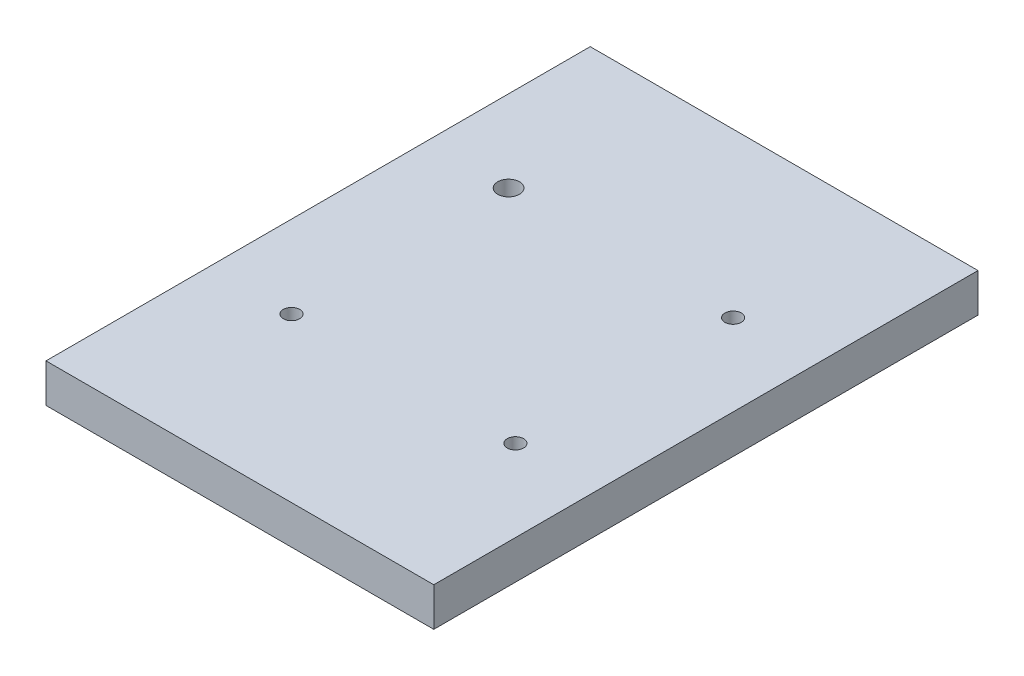
ISO-10303-21;
HEADER;
FILE_DESCRIPTION(('STEP AP214'),'2;1');
FILE_NAME('part.step','',(''),(''),'','','');
FILE_SCHEMA(('AUTOMOTIVE_DESIGN { 1 0 10303 214 1 1 1 1 }'));
ENDSEC;
DATA;
#1=APPLICATION_CONTEXT('core data for automotive mechanical design processes');
#2=APPLICATION_PROTOCOL_DEFINITION('international standard','automotive_design',2000,#1);
#3=PRODUCT_CONTEXT('',#1,'mechanical');
#4=PRODUCT('Part','Part','',(#3));
#5=PRODUCT_RELATED_PRODUCT_CATEGORY('part','',(#4));
#6=PRODUCT_DEFINITION_FORMATION('','',#4);
#7=PRODUCT_DEFINITION_CONTEXT('part definition',#1,'design');
#8=PRODUCT_DEFINITION('design','',#6,#7);
#9=PRODUCT_DEFINITION_SHAPE('','',#8);
#10=(LENGTH_UNIT() NAMED_UNIT(*) SI_UNIT(.MILLI.,.METRE.));
#11=(NAMED_UNIT(*) PLANE_ANGLE_UNIT() SI_UNIT($,.RADIAN.));
#12=(NAMED_UNIT(*) SI_UNIT($,.STERADIAN.) SOLID_ANGLE_UNIT());
#13=UNCERTAINTY_MEASURE_WITH_UNIT(LENGTH_MEASURE(1.E-05),#10,'distance_accuracy_value','');
#14=(GEOMETRIC_REPRESENTATION_CONTEXT(3) GLOBAL_UNCERTAINTY_ASSIGNED_CONTEXT((#13)) GLOBAL_UNIT_ASSIGNED_CONTEXT((#10,
#11,#12)) REPRESENTATION_CONTEXT('',''));
#15=CARTESIAN_POINT('',(0.,0.,0.));
#16=DIRECTION('',(0.,0.,1.));
#17=DIRECTION('',(1.,0.,0.));
#18=AXIS2_PLACEMENT_3D('',#15,#16,#17);
#19=CARTESIAN_POINT('',(25.786244138034,3.55000000000001,0.));
#20=DIRECTION('',(1.,0.,0.));
#21=DIRECTION('',(0.,0.,-1.));
#22=AXIS2_PLACEMENT_3D('',#19,#20,#21);
#23=PLANE('',#22);
#24=DIRECTION('',(0.,0.,1.));
#25=VECTOR('',#24,1.);
#26=CARTESIAN_POINT('',(25.786244138034,-3.55000000000001,0.));
#27=LINE('',#26,#25);
#28=CARTESIAN_POINT('',(25.786244138034,-3.55000000000001,38.3013726708996));
#29=VERTEX_POINT('',#28);
#30=CARTESIAN_POINT('',(25.786244138034,-3.55000000000001,138.3013726709));
#31=VERTEX_POINT('',#30);
#32=EDGE_CURVE('E114',#29,#31,#27,.T.);
#33=ORIENTED_EDGE('',*,*,#32,.F.);
#34=DIRECTION('',(0.,-1.,0.));
#35=VECTOR('',#34,1.);
#36=CARTESIAN_POINT('',(25.786244138034,3.55000000000001,38.3013726708996));
#37=LINE('',#36,#35);
#38=CARTESIAN_POINT('',(25.786244138034,3.55000000000001,38.3013726708996));
#39=VERTEX_POINT('',#38);
#40=EDGE_CURVE('E11',#39,#29,#37,.T.);
#41=ORIENTED_EDGE('',*,*,#40,.F.);
#42=DIRECTION('',(0.,0.,1.));
#43=VECTOR('',#42,1.);
#44=CARTESIAN_POINT('',(25.786244138034,3.55000000000001,0.));
#45=LINE('',#44,#43);
#46=CARTESIAN_POINT('',(25.786244138034,3.55000000000001,138.3013726709));
#47=VERTEX_POINT('',#46);
#48=EDGE_CURVE('E103',#39,#47,#45,.T.);
#49=ORIENTED_EDGE('',*,*,#48,.T.);
#50=DIRECTION('',(0.,-1.,0.));
#51=VECTOR('',#50,1.);
#52=CARTESIAN_POINT('',(25.786244138034,3.55000000000001,138.3013726709));
#53=LINE('',#52,#51);
#54=EDGE_CURVE('E82',#47,#31,#53,.T.);
#55=ORIENTED_EDGE('',*,*,#54,.T.);
#56=EDGE_LOOP('',(#33,#41,#49,#55));
#57=FACE_BOUND('',#56,.T.);
#58=ADVANCED_FACE('F43',(#57),#23,.T.);
#59=CARTESIAN_POINT('',(0.,3.55000000000001,38.3013726708996));
#60=DIRECTION('',(0.,0.,-1.));
#61=DIRECTION('',(-1.,0.,0.));
#62=AXIS2_PLACEMENT_3D('',#59,#60,#61);
#63=PLANE('',#62);
#64=DIRECTION('',(1.,0.,0.));
#65=VECTOR('',#64,1.);
#66=CARTESIAN_POINT('',(0.,-3.55000000000001,38.3013726708996));
#67=LINE('',#66,#65);
#68=CARTESIAN_POINT('',(-45.4667335164913,-3.55000000000001,38.3013726708996));
#69=VERTEX_POINT('',#68);
#70=EDGE_CURVE('E95',#69,#29,#67,.T.);
#71=ORIENTED_EDGE('',*,*,#70,.F.);
#72=DIRECTION('',(0.,-1.,0.));
#73=VECTOR('',#72,1.);
#74=CARTESIAN_POINT('',(-45.4667335164913,3.55000000000001,38.3013726708996));
#75=LINE('',#74,#73);
#76=CARTESIAN_POINT('',(-45.4667335164913,3.55000000000001,38.3013726708996));
#77=VERTEX_POINT('',#76);
#78=EDGE_CURVE('E52',#77,#69,#75,.T.);
#79=ORIENTED_EDGE('',*,*,#78,.F.);
#80=DIRECTION('',(1.,0.,0.));
#81=VECTOR('',#80,1.);
#82=CARTESIAN_POINT('',(0.,3.55000000000001,38.3013726708996));
#83=LINE('',#82,#81);
#84=EDGE_CURVE('E93',#77,#39,#83,.T.);
#85=ORIENTED_EDGE('',*,*,#84,.T.);
#86=ORIENTED_EDGE('',*,*,#40,.T.);
#87=EDGE_LOOP('',(#71,#79,#85,#86));
#88=FACE_BOUND('',#87,.T.);
#89=ADVANCED_FACE('F91',(#88),#63,.T.);
#90=CARTESIAN_POINT('',(-45.4667335164913,3.55000000000001,0.));
#91=DIRECTION('',(1.,0.,0.));
#92=DIRECTION('',(0.,0.,-1.));
#93=AXIS2_PLACEMENT_3D('',#90,#91,#92);
#94=PLANE('',#93);
#95=DIRECTION('',(0.,0.,1.));
#96=VECTOR('',#95,1.);
#97=CARTESIAN_POINT('',(-45.4667335164913,-3.55000000000001,0.));
#98=LINE('',#97,#96);
#99=CARTESIAN_POINT('',(-45.4667335164913,-3.55000000000001,138.3013726709));
#100=VERTEX_POINT('',#99);
#101=EDGE_CURVE('E75',#69,#100,#98,.T.);
#102=ORIENTED_EDGE('',*,*,#101,.T.);
#103=DIRECTION('',(0.,-1.,0.));
#104=VECTOR('',#103,1.);
#105=CARTESIAN_POINT('',(-45.4667335164913,3.55000000000001,138.3013726709));
#106=LINE('',#105,#104);
#107=CARTESIAN_POINT('',(-45.4667335164913,3.55000000000001,138.3013726709));
#108=VERTEX_POINT('',#107);
#109=EDGE_CURVE('E97',#108,#100,#106,.T.);
#110=ORIENTED_EDGE('',*,*,#109,.F.);
#111=DIRECTION('',(0.,0.,1.));
#112=VECTOR('',#111,1.);
#113=CARTESIAN_POINT('',(-45.4667335164913,3.55000000000001,0.));
#114=LINE('',#113,#112);
#115=EDGE_CURVE('E98',#77,#108,#114,.T.);
#116=ORIENTED_EDGE('',*,*,#115,.F.);
#117=ORIENTED_EDGE('',*,*,#78,.T.);
#118=EDGE_LOOP('',(#102,#110,#116,#117));
#119=FACE_BOUND('',#118,.T.);
#120=ADVANCED_FACE('F99',(#119),#94,.F.);
#121=CARTESIAN_POINT('',(0.,3.55000000000001,138.3013726709));
#122=DIRECTION('',(0.,0.,-1.));
#123=DIRECTION('',(-1.,0.,0.));
#124=AXIS2_PLACEMENT_3D('',#121,#122,#123);
#125=PLANE('',#124);
#126=DIRECTION('',(1.,0.,0.));
#127=VECTOR('',#126,1.);
#128=CARTESIAN_POINT('',(0.,-3.55000000000001,138.3013726709));
#129=LINE('',#128,#127);
#130=EDGE_CURVE('E108',#100,#31,#129,.T.);
#131=ORIENTED_EDGE('',*,*,#130,.T.);
#132=ORIENTED_EDGE('',*,*,#54,.F.);
#133=DIRECTION('',(1.,0.,0.));
#134=VECTOR('',#133,1.);
#135=CARTESIAN_POINT('',(0.,3.55000000000001,138.3013726709));
#136=LINE('',#135,#134);
#137=EDGE_CURVE('E60',#108,#47,#136,.T.);
#138=ORIENTED_EDGE('',*,*,#137,.F.);
#139=ORIENTED_EDGE('',*,*,#109,.T.);
#140=EDGE_LOOP('',(#131,#132,#138,#139));
#141=FACE_BOUND('',#140,.T.);
#142=ADVANCED_FACE('F131',(#141),#125,.F.);
#143=CARTESIAN_POINT('',(0.,3.55000000000001,0.));
#144=DIRECTION('',(0.,1.,0.));
#145=DIRECTION('',(0.,0.,1.));
#146=AXIS2_PLACEMENT_3D('',#143,#144,#145);
#147=PLANE('',#146);
#148=CARTESIAN_POINT('',(-30.4667335164913,3.55000000000001,68.3013726708996));
#149=DIRECTION('',(0.,1.,0.));
#150=DIRECTION('',(0.,0.,1.));
#151=AXIS2_PLACEMENT_3D('',#148,#149,#150);
#152=CIRCLE('',#151,2.);
#153=CARTESIAN_POINT('',(-30.4667335164913,3.55000000000001,70.3013726708996));
#154=VERTEX_POINT('',#153);
#155=EDGE_CURVE('E193',#154,#154,#152,.T.);
#156=ORIENTED_EDGE('',*,*,#155,.F.);
#157=EDGE_LOOP('',(#156));
#158=FACE_BOUND('',#157,.T.);
#159=CARTESIAN_POINT('',(-30.3587349299659,3.55000000000001,108.3013726709));
#160=DIRECTION('',(0.,1.,0.));
#161=DIRECTION('',(0.,0.,-1.));
#162=AXIS2_PLACEMENT_3D('',#159,#160,#161);
#163=CIRCLE('',#162,1.5);
#164=CARTESIAN_POINT('',(-30.3587349299659,3.55000000000001,106.8013726709));
#165=VERTEX_POINT('',#164);
#166=EDGE_CURVE('E183',#165,#165,#163,.T.);
#167=ORIENTED_EDGE('',*,*,#166,.F.);
#168=EDGE_LOOP('',(#167));
#169=FACE_BOUND('',#168,.T.);
#170=CARTESIAN_POINT('',(10.786244138034,3.55000000000001,108.3013726709));
#171=DIRECTION('',(0.,1.,0.));
#172=DIRECTION('',(0.,0.,1.));
#173=AXIS2_PLACEMENT_3D('',#170,#171,#172);
#174=CIRCLE('',#173,1.5);
#175=CARTESIAN_POINT('',(10.786244138034,3.55000000000001,109.8013726709));
#176=VERTEX_POINT('',#175);
#177=EDGE_CURVE('E174',#176,#176,#174,.T.);
#178=ORIENTED_EDGE('',*,*,#177,.F.);
#179=EDGE_LOOP('',(#178));
#180=FACE_BOUND('',#179,.T.);
#181=CARTESIAN_POINT('',(10.786244138034,3.55000000000001,68.3013726708996));
#182=DIRECTION('',(0.,1.,0.));
#183=DIRECTION('',(0.,0.,1.));
#184=AXIS2_PLACEMENT_3D('',#181,#182,#183);
#185=CIRCLE('',#184,1.5);
#186=CARTESIAN_POINT('',(10.786244138034,3.55000000000001,69.8013726708996));
#187=VERTEX_POINT('',#186);
#188=EDGE_CURVE('E177',#187,#187,#185,.T.);
#189=ORIENTED_EDGE('',*,*,#188,.F.);
#190=EDGE_LOOP('',(#189));
#191=FACE_BOUND('',#190,.T.);
#192=ORIENTED_EDGE('',*,*,#48,.F.);
#193=ORIENTED_EDGE('',*,*,#84,.F.);
#194=ORIENTED_EDGE('',*,*,#115,.T.);
#195=ORIENTED_EDGE('',*,*,#137,.T.);
#196=EDGE_LOOP('',(#192,#193,#194,#195));
#197=FACE_BOUND('',#196,.T.);
#198=ADVANCED_FACE('F102',(#158,#169,#180,#191,#197),#147,.T.);
#199=CARTESIAN_POINT('',(0.,-3.55000000000001,0.));
#200=DIRECTION('',(0.,1.,0.));
#201=DIRECTION('',(0.,0.,1.));
#202=AXIS2_PLACEMENT_3D('',#199,#200,#201);
#203=PLANE('',#202);
#204=CARTESIAN_POINT('',(-30.4667335164913,-3.55000000000001,68.3013726708996));
#205=DIRECTION('',(0.,1.,0.));
#206=DIRECTION('',(0.,0.,1.));
#207=AXIS2_PLACEMENT_3D('',#204,#205,#206);
#208=CIRCLE('',#207,2.);
#209=CARTESIAN_POINT('',(-30.4667335164913,-3.55000000000001,70.3013726708996));
#210=VERTEX_POINT('',#209);
#211=EDGE_CURVE('E197',#210,#210,#208,.T.);
#212=ORIENTED_EDGE('',*,*,#211,.T.);
#213=EDGE_LOOP('',(#212));
#214=FACE_BOUND('',#213,.T.);
#215=CARTESIAN_POINT('',(-30.3587349299659,-3.55000000000001,108.3013726709));
#216=DIRECTION('',(0.,1.,0.));
#217=DIRECTION('',(0.,0.,-1.));
#218=AXIS2_PLACEMENT_3D('',#215,#216,#217);
#219=CIRCLE('',#218,1.5);
#220=CARTESIAN_POINT('',(-30.3587349299659,-3.55000000000001,106.8013726709));
#221=VERTEX_POINT('',#220);
#222=EDGE_CURVE('E189',#221,#221,#219,.T.);
#223=ORIENTED_EDGE('',*,*,#222,.T.);
#224=EDGE_LOOP('',(#223));
#225=FACE_BOUND('',#224,.T.);
#226=CARTESIAN_POINT('',(10.786244138034,-3.55000000000001,108.3013726709));
#227=DIRECTION('',(0.,1.,0.));
#228=DIRECTION('',(0.,0.,1.));
#229=AXIS2_PLACEMENT_3D('',#226,#227,#228);
#230=CIRCLE('',#229,1.5);
#231=CARTESIAN_POINT('',(10.786244138034,-3.55000000000001,109.8013726709));
#232=VERTEX_POINT('',#231);
#233=EDGE_CURVE('E171',#232,#232,#230,.T.);
#234=ORIENTED_EDGE('',*,*,#233,.T.);
#235=EDGE_LOOP('',(#234));
#236=FACE_BOUND('',#235,.T.);
#237=CARTESIAN_POINT('',(10.786244138034,-3.55000000000001,68.3013726708996));
#238=DIRECTION('',(0.,1.,0.));
#239=DIRECTION('',(0.,0.,1.));
#240=AXIS2_PLACEMENT_3D('',#237,#238,#239);
#241=CIRCLE('',#240,1.5);
#242=CARTESIAN_POINT('',(10.786244138034,-3.55000000000001,69.8013726708996));
#243=VERTEX_POINT('',#242);
#244=EDGE_CURVE('E118',#243,#243,#241,.T.);
#245=ORIENTED_EDGE('',*,*,#244,.T.);
#246=EDGE_LOOP('',(#245));
#247=FACE_BOUND('',#246,.T.);
#248=ORIENTED_EDGE('',*,*,#32,.T.);
#249=ORIENTED_EDGE('',*,*,#130,.F.);
#250=ORIENTED_EDGE('',*,*,#101,.F.);
#251=ORIENTED_EDGE('',*,*,#70,.T.);
#252=EDGE_LOOP('',(#248,#249,#250,#251));
#253=FACE_BOUND('',#252,.T.);
#254=ADVANCED_FACE('F133',(#214,#225,#236,#247,#253),#203,.F.);
#255=CARTESIAN_POINT('',(10.786244138034,-3.55000000000001,68.3013726708996));
#256=DIRECTION('',(0.,1.,0.));
#257=DIRECTION('',(0.,0.,1.));
#258=AXIS2_PLACEMENT_3D('',#255,#256,#257);
#259=CYLINDRICAL_SURFACE('',#258,1.5);
#260=ORIENTED_EDGE('',*,*,#244,.F.);
#261=EDGE_LOOP('',(#260));
#262=FACE_BOUND('',#261,.T.);
#263=ORIENTED_EDGE('',*,*,#188,.T.);
#264=EDGE_LOOP('',(#263));
#265=FACE_BOUND('',#264,.T.);
#266=ADVANCED_FACE('F147',(#262,#265),#259,.F.);
#267=CARTESIAN_POINT('',(10.786244138034,-3.55000000000001,108.3013726709));
#268=DIRECTION('',(0.,1.,0.));
#269=DIRECTION('',(0.,0.,1.));
#270=AXIS2_PLACEMENT_3D('',#267,#268,#269);
#271=CYLINDRICAL_SURFACE('',#270,1.5);
#272=ORIENTED_EDGE('',*,*,#233,.F.);
#273=EDGE_LOOP('',(#272));
#274=FACE_BOUND('',#273,.T.);
#275=ORIENTED_EDGE('',*,*,#177,.T.);
#276=EDGE_LOOP('',(#275));
#277=FACE_BOUND('',#276,.T.);
#278=ADVANCED_FACE('F154',(#274,#277),#271,.F.);
#279=CARTESIAN_POINT('',(-30.3587349299659,-3.55000000000001,108.3013726709));
#280=DIRECTION('',(0.,1.,0.));
#281=DIRECTION('',(0.,0.,1.));
#282=AXIS2_PLACEMENT_3D('',#279,#280,#281);
#283=CYLINDRICAL_SURFACE('',#282,1.5);
#284=ORIENTED_EDGE('',*,*,#222,.F.);
#285=EDGE_LOOP('',(#284));
#286=FACE_BOUND('',#285,.T.);
#287=ORIENTED_EDGE('',*,*,#166,.T.);
#288=EDGE_LOOP('',(#287));
#289=FACE_BOUND('',#288,.T.);
#290=ADVANCED_FACE('F159',(#286,#289),#283,.F.);
#291=CARTESIAN_POINT('',(-30.4667335164913,-3.55000000000001,68.3013726708996));
#292=DIRECTION('',(0.,1.,0.));
#293=DIRECTION('',(0.,0.,1.));
#294=AXIS2_PLACEMENT_3D('',#291,#292,#293);
#295=CYLINDRICAL_SURFACE('',#294,2.);
#296=ORIENTED_EDGE('',*,*,#211,.F.);
#297=EDGE_LOOP('',(#296));
#298=FACE_BOUND('',#297,.T.);
#299=ORIENTED_EDGE('',*,*,#155,.T.);
#300=EDGE_LOOP('',(#299));
#301=FACE_BOUND('',#300,.T.);
#302=ADVANCED_FACE('F156',(#298,#301),#295,.F.);
#303=CLOSED_SHELL('',(#58,#89,#120,#142,#198,#254,#266,#278,#290,#302));
#304=MANIFOLD_SOLID_BREP('B2',#303);
#305=ADVANCED_BREP_SHAPE_REPRESENTATION('',(#18,#304),#14);
#306=SHAPE_DEFINITION_REPRESENTATION(#9,#305);
ENDSEC;
END-ISO-10303-21;
